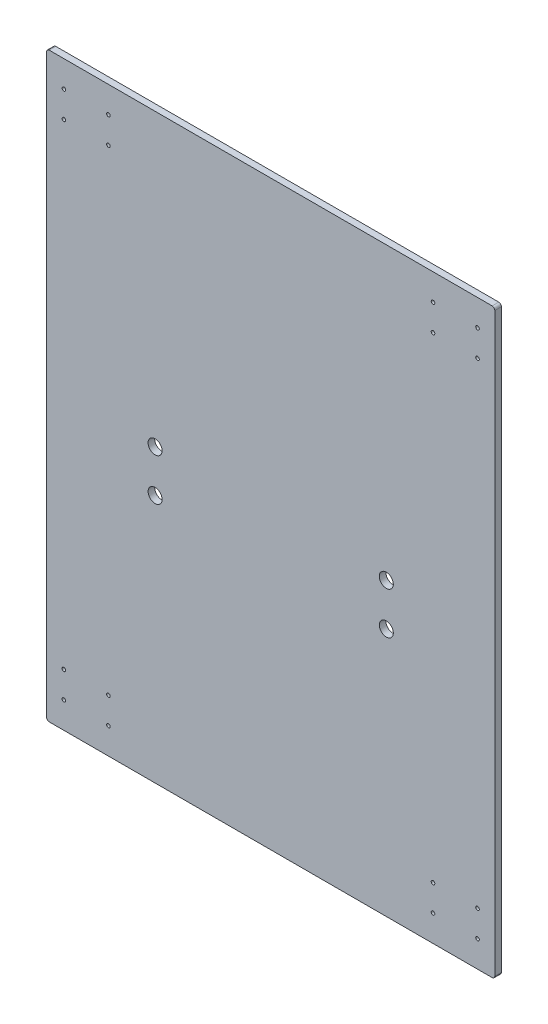
ISO-10303-21;
HEADER;
FILE_DESCRIPTION(('STEP AP214'),'2;1');
FILE_NAME('part.step','',(''),(''),'','','');
FILE_SCHEMA(('AUTOMOTIVE_DESIGN { 1 0 10303 214 1 1 1 1 }'));
ENDSEC;
DATA;
#1=APPLICATION_CONTEXT('core data for automotive mechanical design processes');
#2=APPLICATION_PROTOCOL_DEFINITION('international standard','automotive_design',2000,#1);
#3=PRODUCT_CONTEXT('',#1,'mechanical');
#4=PRODUCT('Part','Part','',(#3));
#5=PRODUCT_RELATED_PRODUCT_CATEGORY('part','',(#4));
#6=PRODUCT_DEFINITION_FORMATION('','',#4);
#7=PRODUCT_DEFINITION_CONTEXT('part definition',#1,'design');
#8=PRODUCT_DEFINITION('design','',#6,#7);
#9=PRODUCT_DEFINITION_SHAPE('','',#8);
#10=(LENGTH_UNIT() NAMED_UNIT(*) SI_UNIT(.MILLI.,.METRE.));
#11=(NAMED_UNIT(*) PLANE_ANGLE_UNIT() SI_UNIT($,.RADIAN.));
#12=(NAMED_UNIT(*) SI_UNIT($,.STERADIAN.) SOLID_ANGLE_UNIT());
#13=UNCERTAINTY_MEASURE_WITH_UNIT(LENGTH_MEASURE(1.E-05),#10,'distance_accuracy_value','');
#14=(GEOMETRIC_REPRESENTATION_CONTEXT(3) GLOBAL_UNCERTAINTY_ASSIGNED_CONTEXT((#13)) GLOBAL_UNIT_ASSIGNED_CONTEXT((#10,
#11,#12)) REPRESENTATION_CONTEXT('',''));
#15=CARTESIAN_POINT('',(0.,0.,0.));
#16=DIRECTION('',(0.,0.,1.));
#17=DIRECTION('',(1.,0.,0.));
#18=AXIS2_PLACEMENT_3D('',#15,#16,#17);
#19=CARTESIAN_POINT('',(0.,0.,0.));
#20=DIRECTION('',(0.,0.,1.));
#21=DIRECTION('',(1.,0.,0.));
#22=AXIS2_PLACEMENT_3D('',#19,#20,#21);
#23=PLANE('',#22);
#24=CARTESIAN_POINT('',(-21.4375999999999,-496.966887406221,0.));
#25=DIRECTION('',(0.,0.,-1.));
#26=DIRECTION('',(-1.,0.,0.));
#27=AXIS2_PLACEMENT_3D('',#24,#25,#26);
#28=CIRCLE('',#27,1.7272);
#29=CARTESIAN_POINT('',(-23.1647999999999,-496.966887406221,0.));
#30=VERTEX_POINT('',#29);
#31=EDGE_CURVE('E241',#30,#30,#28,.T.);
#32=ORIENTED_EDGE('',*,*,#31,.F.);
#33=EDGE_LOOP('',(#32));
#34=FACE_BOUND('',#33,.T.);
#35=CARTESIAN_POINT('',(377.0376,-471.566887406221,0.));
#36=DIRECTION('',(0.,0.,-1.));
#37=DIRECTION('',(-1.,0.,0.));
#38=AXIS2_PLACEMENT_3D('',#35,#36,#37);
#39=CIRCLE('',#38,1.72719999999998);
#40=CARTESIAN_POINT('',(375.3104,-471.566887406221,0.));
#41=VERTEX_POINT('',#40);
#42=EDGE_CURVE('E211',#41,#41,#39,.T.);
#43=ORIENTED_EDGE('',*,*,#42,.F.);
#44=EDGE_LOOP('',(#43));
#45=FACE_BOUND('',#44,.T.);
#46=CARTESIAN_POINT('',(377.0376,-496.966887406221,0.));
#47=DIRECTION('',(0.,0.,-1.));
#48=DIRECTION('',(-1.,0.,0.));
#49=AXIS2_PLACEMENT_3D('',#46,#47,#48);
#50=CIRCLE('',#49,1.72719999999998);
#51=CARTESIAN_POINT('',(375.3104,-496.966887406221,0.));
#52=VERTEX_POINT('',#51);
#53=EDGE_CURVE('E205',#52,#52,#50,.T.);
#54=ORIENTED_EDGE('',*,*,#53,.F.);
#55=EDGE_LOOP('',(#54));
#56=FACE_BOUND('',#55,.T.);
#57=CARTESIAN_POINT('',(289.17138,-241.82,0.));
#58=DIRECTION('',(0.,0.,-1.));
#59=DIRECTION('',(-1.,0.,0.));
#60=AXIS2_PLACEMENT_3D('',#57,#58,#59);
#61=CIRCLE('',#60,6.74624000000001);
#62=CARTESIAN_POINT('',(282.42514,-241.82,0.));
#63=VERTEX_POINT('',#62);
#64=EDGE_CURVE('E199',#63,#63,#61,.T.);
#65=ORIENTED_EDGE('',*,*,#64,.F.);
#66=EDGE_LOOP('',(#65));
#67=FACE_BOUND('',#66,.T.);
#68=CARTESIAN_POINT('',(66.4286200000001,-282.46,0.));
#69=DIRECTION('',(0.,0.,-1.));
#70=DIRECTION('',(-1.,0.,0.));
#71=AXIS2_PLACEMENT_3D('',#68,#69,#70);
#72=CIRCLE('',#71,6.74624);
#73=CARTESIAN_POINT('',(59.6823800000001,-282.46,0.));
#74=VERTEX_POINT('',#73);
#75=EDGE_CURVE('E187',#74,#74,#72,.T.);
#76=ORIENTED_EDGE('',*,*,#75,.F.);
#77=EDGE_LOOP('',(#76));
#78=FACE_BOUND('',#77,.T.);
#79=CARTESIAN_POINT('',(66.4286200000001,-241.82,0.));
#80=DIRECTION('',(0.,0.,-1.));
#81=DIRECTION('',(-1.,0.,0.));
#82=AXIS2_PLACEMENT_3D('',#79,#80,#81);
#83=CIRCLE('',#82,6.74624);
#84=CARTESIAN_POINT('',(59.6823800000001,-241.82,0.));
#85=VERTEX_POINT('',#84);
#86=EDGE_CURVE('E174',#85,#85,#83,.T.);
#87=ORIENTED_EDGE('',*,*,#86,.F.);
#88=EDGE_LOOP('',(#87));
#89=FACE_BOUND('',#88,.T.);
#90=DIRECTION('',(-1.,0.,0.));
#91=VECTOR('',#90,1.);
#92=CARTESIAN_POINT('',(393.7,38.1,0.));
#93=LINE('',#92,#91);
#94=CARTESIAN_POINT('',(391.16,38.1,0.));
#95=VERTEX_POINT('',#94);
#96=CARTESIAN_POINT('',(-35.5599999999999,38.1,0.));
#97=VERTEX_POINT('',#96);
#98=EDGE_CURVE('E124',#95,#97,#93,.T.);
#99=ORIENTED_EDGE('',*,*,#98,.F.);
#100=CARTESIAN_POINT('',(391.16,35.56,0.));
#101=DIRECTION('',(0.,0.,1.));
#102=DIRECTION('',(1.,0.,0.));
#103=AXIS2_PLACEMENT_3D('',#100,#101,#102);
#104=CIRCLE('',#103,2.54);
#105=CARTESIAN_POINT('',(393.7,35.56,0.));
#106=VERTEX_POINT('',#105);
#107=EDGE_CURVE('E107',#95,#106,#104,.F.);
#108=ORIENTED_EDGE('',*,*,#107,.T.);
#109=DIRECTION('',(0.,1.,0.));
#110=VECTOR('',#109,1.);
#111=CARTESIAN_POINT('',(393.7,-522.366887406221,0.));
#112=LINE('',#111,#110);
#113=CARTESIAN_POINT('',(393.7,-519.826887406221,0.));
#114=VERTEX_POINT('',#113);
#115=EDGE_CURVE('E134',#114,#106,#112,.T.);
#116=ORIENTED_EDGE('',*,*,#115,.F.);
#117=CARTESIAN_POINT('',(391.16,-519.826887406221,0.));
#118=DIRECTION('',(0.,0.,1.));
#119=DIRECTION('',(1.,0.,0.));
#120=AXIS2_PLACEMENT_3D('',#117,#118,#119);
#121=CIRCLE('',#120,2.54);
#122=CARTESIAN_POINT('',(391.16,-522.366887406221,0.));
#123=VERTEX_POINT('',#122);
#124=EDGE_CURVE('E118',#114,#123,#121,.F.);
#125=ORIENTED_EDGE('',*,*,#124,.T.);
#126=DIRECTION('',(1.,0.,0.));
#127=VECTOR('',#126,1.);
#128=CARTESIAN_POINT('',(393.7,-522.366887406221,0.));
#129=LINE('',#128,#127);
#130=CARTESIAN_POINT('',(-35.5599999999999,-522.366887406221,0.));
#131=VERTEX_POINT('',#130);
#132=EDGE_CURVE('E138',#131,#123,#129,.T.);
#133=ORIENTED_EDGE('',*,*,#132,.F.);
#134=CARTESIAN_POINT('',(-35.56,-519.826887406221,0.));
#135=DIRECTION('',(0.,0.,1.));
#136=DIRECTION('',(1.,0.,0.));
#137=AXIS2_PLACEMENT_3D('',#134,#135,#136);
#138=CIRCLE('',#137,2.54);
#139=CARTESIAN_POINT('',(-38.1,-519.826887406221,0.));
#140=VERTEX_POINT('',#139);
#141=EDGE_CURVE('E144',#131,#140,#138,.F.);
#142=ORIENTED_EDGE('',*,*,#141,.T.);
#143=DIRECTION('',(0.,-1.,0.));
#144=VECTOR('',#143,1.);
#145=CARTESIAN_POINT('',(-38.1,-522.366887406221,0.));
#146=LINE('',#145,#144);
#147=CARTESIAN_POINT('',(-38.1,35.56,0.));
#148=VERTEX_POINT('',#147);
#149=EDGE_CURVE('E166',#148,#140,#146,.T.);
#150=ORIENTED_EDGE('',*,*,#149,.F.);
#151=CARTESIAN_POINT('',(-35.56,35.56,0.));
#152=DIRECTION('',(0.,0.,1.));
#153=DIRECTION('',(1.,0.,0.));
#154=AXIS2_PLACEMENT_3D('',#151,#152,#153);
#155=CIRCLE('',#154,2.54);
#156=EDGE_CURVE('E128',#148,#97,#155,.F.);
#157=ORIENTED_EDGE('',*,*,#156,.T.);
#158=EDGE_LOOP('',(#99,#108,#116,#125,#133,#142,#150,#157));
#159=FACE_BOUND('',#158,.T.);
#160=CARTESIAN_POINT('',(289.17138,-282.46,0.));
#161=DIRECTION('',(0.,0.,-1.));
#162=DIRECTION('',(-1.,0.,0.));
#163=AXIS2_PLACEMENT_3D('',#160,#161,#162);
#164=CIRCLE('',#163,6.74624000000001);
#165=CARTESIAN_POINT('',(282.42514,-282.46,0.));
#166=VERTEX_POINT('',#165);
#167=EDGE_CURVE('E193',#166,#166,#164,.T.);
#168=ORIENTED_EDGE('',*,*,#167,.F.);
#169=EDGE_LOOP('',(#168));
#170=FACE_BOUND('',#169,.T.);
#171=CARTESIAN_POINT('',(334.1624,-496.966887406221,0.));
#172=DIRECTION('',(0.,0.,-1.));
#173=DIRECTION('',(-1.,0.,0.));
#174=AXIS2_PLACEMENT_3D('',#171,#172,#173);
#175=CIRCLE('',#174,1.72719999999998);
#176=CARTESIAN_POINT('',(332.4352,-496.966887406221,0.));
#177=VERTEX_POINT('',#176);
#178=EDGE_CURVE('E217',#177,#177,#175,.T.);
#179=ORIENTED_EDGE('',*,*,#178,.F.);
#180=EDGE_LOOP('',(#179));
#181=FACE_BOUND('',#180,.T.);
#182=CARTESIAN_POINT('',(334.1624,-471.566887406221,0.));
#183=DIRECTION('',(0.,0.,-1.));
#184=DIRECTION('',(-1.,0.,0.));
#185=AXIS2_PLACEMENT_3D('',#182,#183,#184);
#186=CIRCLE('',#185,1.72719999999998);
#187=CARTESIAN_POINT('',(332.4352,-471.566887406221,0.));
#188=VERTEX_POINT('',#187);
#189=EDGE_CURVE('E223',#188,#188,#186,.T.);
#190=ORIENTED_EDGE('',*,*,#189,.F.);
#191=EDGE_LOOP('',(#190));
#192=FACE_BOUND('',#191,.T.);
#193=CARTESIAN_POINT('',(21.4376000000001,-471.566887406221,0.));
#194=DIRECTION('',(0.,0.,-1.));
#195=DIRECTION('',(-1.,0.,0.));
#196=AXIS2_PLACEMENT_3D('',#193,#194,#195);
#197=CIRCLE('',#196,1.7272);
#198=CARTESIAN_POINT('',(19.7104000000001,-471.566887406221,0.));
#199=VERTEX_POINT('',#198);
#200=EDGE_CURVE('E229',#199,#199,#197,.T.);
#201=ORIENTED_EDGE('',*,*,#200,.F.);
#202=EDGE_LOOP('',(#201));
#203=FACE_BOUND('',#202,.T.);
#204=CARTESIAN_POINT('',(-21.4375999999999,-471.566887406221,0.));
#205=DIRECTION('',(0.,0.,-1.));
#206=DIRECTION('',(-1.,0.,0.));
#207=AXIS2_PLACEMENT_3D('',#204,#205,#206);
#208=CIRCLE('',#207,1.7272);
#209=CARTESIAN_POINT('',(-23.1647999999999,-471.566887406221,0.));
#210=VERTEX_POINT('',#209);
#211=EDGE_CURVE('E235',#210,#210,#208,.T.);
#212=ORIENTED_EDGE('',*,*,#211,.F.);
#213=EDGE_LOOP('',(#212));
#214=FACE_BOUND('',#213,.T.);
#215=CARTESIAN_POINT('',(21.4376000000001,-496.966887406221,0.));
#216=DIRECTION('',(0.,0.,-1.));
#217=DIRECTION('',(-1.,0.,0.));
#218=AXIS2_PLACEMENT_3D('',#215,#216,#217);
#219=CIRCLE('',#218,1.7272);
#220=CARTESIAN_POINT('',(19.7104000000001,-496.966887406221,0.));
#221=VERTEX_POINT('',#220);
#222=EDGE_CURVE('E247',#221,#221,#219,.T.);
#223=ORIENTED_EDGE('',*,*,#222,.F.);
#224=EDGE_LOOP('',(#223));
#225=FACE_BOUND('',#224,.T.);
#226=CARTESIAN_POINT('',(21.4376000000001,12.7,0.));
#227=DIRECTION('',(0.,0.,-1.));
#228=DIRECTION('',(-1.,0.,0.));
#229=AXIS2_PLACEMENT_3D('',#226,#227,#228);
#230=CIRCLE('',#229,1.7272);
#231=CARTESIAN_POINT('',(19.7104000000001,12.7,0.));
#232=VERTEX_POINT('',#231);
#233=EDGE_CURVE('E253',#232,#232,#230,.T.);
#234=ORIENTED_EDGE('',*,*,#233,.F.);
#235=EDGE_LOOP('',(#234));
#236=FACE_BOUND('',#235,.T.);
#237=CARTESIAN_POINT('',(-21.4375999999999,12.7,0.));
#238=DIRECTION('',(0.,0.,-1.));
#239=DIRECTION('',(-1.,0.,0.));
#240=AXIS2_PLACEMENT_3D('',#237,#238,#239);
#241=CIRCLE('',#240,1.7272);
#242=CARTESIAN_POINT('',(-23.1647999999999,12.7,0.));
#243=VERTEX_POINT('',#242);
#244=EDGE_CURVE('E259',#243,#243,#241,.T.);
#245=ORIENTED_EDGE('',*,*,#244,.F.);
#246=EDGE_LOOP('',(#245));
#247=FACE_BOUND('',#246,.T.);
#248=CARTESIAN_POINT('',(-21.4375999999999,-12.7,0.));
#249=DIRECTION('',(0.,0.,-1.));
#250=DIRECTION('',(-1.,0.,0.));
#251=AXIS2_PLACEMENT_3D('',#248,#249,#250);
#252=CIRCLE('',#251,1.7272);
#253=CARTESIAN_POINT('',(-23.1647999999999,-12.7,0.));
#254=VERTEX_POINT('',#253);
#255=EDGE_CURVE('E265',#254,#254,#252,.T.);
#256=ORIENTED_EDGE('',*,*,#255,.F.);
#257=EDGE_LOOP('',(#256));
#258=FACE_BOUND('',#257,.T.);
#259=CARTESIAN_POINT('',(21.4376000000001,-12.7,0.));
#260=DIRECTION('',(0.,0.,-1.));
#261=DIRECTION('',(-1.,0.,0.));
#262=AXIS2_PLACEMENT_3D('',#259,#260,#261);
#263=CIRCLE('',#262,1.7272);
#264=CARTESIAN_POINT('',(19.7104000000001,-12.7,0.));
#265=VERTEX_POINT('',#264);
#266=EDGE_CURVE('E271',#265,#265,#263,.T.);
#267=ORIENTED_EDGE('',*,*,#266,.F.);
#268=EDGE_LOOP('',(#267));
#269=FACE_BOUND('',#268,.T.);
#270=CARTESIAN_POINT('',(334.1624,-12.7,0.));
#271=DIRECTION('',(0.,0.,-1.));
#272=DIRECTION('',(-1.,0.,0.));
#273=AXIS2_PLACEMENT_3D('',#270,#271,#272);
#274=CIRCLE('',#273,1.72719999999998);
#275=CARTESIAN_POINT('',(332.4352,-12.7,0.));
#276=VERTEX_POINT('',#275);
#277=EDGE_CURVE('E277',#276,#276,#274,.T.);
#278=ORIENTED_EDGE('',*,*,#277,.F.);
#279=EDGE_LOOP('',(#278));
#280=FACE_BOUND('',#279,.T.);
#281=CARTESIAN_POINT('',(334.1624,12.7,0.));
#282=DIRECTION('',(0.,0.,-1.));
#283=DIRECTION('',(-1.,0.,0.));
#284=AXIS2_PLACEMENT_3D('',#281,#282,#283);
#285=CIRCLE('',#284,1.72719999999998);
#286=CARTESIAN_POINT('',(332.4352,12.7,0.));
#287=VERTEX_POINT('',#286);
#288=EDGE_CURVE('E283',#287,#287,#285,.T.);
#289=ORIENTED_EDGE('',*,*,#288,.F.);
#290=EDGE_LOOP('',(#289));
#291=FACE_BOUND('',#290,.T.);
#292=CARTESIAN_POINT('',(377.0376,-12.7,0.));
#293=DIRECTION('',(0.,0.,-1.));
#294=DIRECTION('',(-1.,0.,0.));
#295=AXIS2_PLACEMENT_3D('',#292,#293,#294);
#296=CIRCLE('',#295,1.72719999999998);
#297=CARTESIAN_POINT('',(375.3104,-12.7,0.));
#298=VERTEX_POINT('',#297);
#299=EDGE_CURVE('E289',#298,#298,#296,.T.);
#300=ORIENTED_EDGE('',*,*,#299,.F.);
#301=EDGE_LOOP('',(#300));
#302=FACE_BOUND('',#301,.T.);
#303=CARTESIAN_POINT('',(377.0376,12.7,0.));
#304=DIRECTION('',(0.,0.,-1.));
#305=DIRECTION('',(-1.,0.,0.));
#306=AXIS2_PLACEMENT_3D('',#303,#304,#305);
#307=CIRCLE('',#306,1.72719999999998);
#308=CARTESIAN_POINT('',(375.3104,12.7,0.));
#309=VERTEX_POINT('',#308);
#310=EDGE_CURVE('E295',#309,#309,#307,.T.);
#311=ORIENTED_EDGE('',*,*,#310,.F.);
#312=EDGE_LOOP('',(#311));
#313=FACE_BOUND('',#312,.T.);
#314=ADVANCED_FACE('F41',(#34,#45,#56,#67,#78,#89,#159,#170,#181,#192,#203,#214,#225,#236,#247,
#258,#269,#280,#291,#302,#313),#23,.F.);
#315=CARTESIAN_POINT('',(-38.1,-522.366887406221,6.35));
#316=DIRECTION('',(1.,0.,0.));
#317=DIRECTION('',(0.,0.,-1.));
#318=AXIS2_PLACEMENT_3D('',#315,#316,#317);
#319=PLANE('',#318);
#320=ORIENTED_EDGE('',*,*,#149,.T.);
#321=DIRECTION('',(0.,0.,-1.));
#322=VECTOR('',#321,1.);
#323=CARTESIAN_POINT('',(-38.1,-519.826887406221,6.35));
#324=LINE('',#323,#322);
#325=CARTESIAN_POINT('',(-38.1,-519.826887406221,6.35));
#326=VERTEX_POINT('',#325);
#327=EDGE_CURVE('E11',#140,#326,#324,.F.);
#328=ORIENTED_EDGE('',*,*,#327,.T.);
#329=DIRECTION('',(0.,-1.,0.));
#330=VECTOR('',#329,1.);
#331=CARTESIAN_POINT('',(-38.1,-522.366887406221,6.35));
#332=LINE('',#331,#330);
#333=CARTESIAN_POINT('',(-38.1,35.56,6.35));
#334=VERTEX_POINT('',#333);
#335=EDGE_CURVE('E133',#334,#326,#332,.T.);
#336=ORIENTED_EDGE('',*,*,#335,.F.);
#337=DIRECTION('',(0.,0.,-1.));
#338=VECTOR('',#337,1.);
#339=CARTESIAN_POINT('',(-38.1,35.56,6.35));
#340=LINE('',#339,#338);
#341=EDGE_CURVE('E49',#334,#148,#340,.T.);
#342=ORIENTED_EDGE('',*,*,#341,.T.);
#343=EDGE_LOOP('',(#320,#328,#336,#342));
#344=FACE_BOUND('',#343,.T.);
#345=ADVANCED_FACE('F165',(#344),#319,.F.);
#346=CARTESIAN_POINT('',(393.7,-522.366887406221,6.35));
#347=DIRECTION('',(0.,1.,0.));
#348=DIRECTION('',(0.,0.,1.));
#349=AXIS2_PLACEMENT_3D('',#346,#347,#348);
#350=PLANE('',#349);
#351=ORIENTED_EDGE('',*,*,#132,.T.);
#352=DIRECTION('',(0.,0.,-1.));
#353=VECTOR('',#352,1.);
#354=CARTESIAN_POINT('',(391.16,-522.366887406221,6.35));
#355=LINE('',#354,#353);
#356=CARTESIAN_POINT('',(391.16,-522.366887406221,6.35));
#357=VERTEX_POINT('',#356);
#358=EDGE_CURVE('E56',#123,#357,#355,.F.);
#359=ORIENTED_EDGE('',*,*,#358,.T.);
#360=DIRECTION('',(1.,0.,0.));
#361=VECTOR('',#360,1.);
#362=CARTESIAN_POINT('',(393.7,-522.366887406221,6.35));
#363=LINE('',#362,#361);
#364=CARTESIAN_POINT('',(-35.5599999999999,-522.366887406221,6.35));
#365=VERTEX_POINT('',#364);
#366=EDGE_CURVE('E136',#365,#357,#363,.T.);
#367=ORIENTED_EDGE('',*,*,#366,.F.);
#368=DIRECTION('',(0.,0.,-1.));
#369=VECTOR('',#368,1.);
#370=CARTESIAN_POINT('',(-35.56,-522.366887406221,6.35));
#371=LINE('',#370,#369);
#372=EDGE_CURVE('E157',#365,#131,#371,.T.);
#373=ORIENTED_EDGE('',*,*,#372,.T.);
#374=EDGE_LOOP('',(#351,#359,#367,#373));
#375=FACE_BOUND('',#374,.T.);
#376=ADVANCED_FACE('F310',(#375),#350,.F.);
#377=CARTESIAN_POINT('',(393.7,-522.366887406221,6.35));
#378=DIRECTION('',(-1.,0.,0.));
#379=DIRECTION('',(0.,0.,1.));
#380=AXIS2_PLACEMENT_3D('',#377,#378,#379);
#381=PLANE('',#380);
#382=ORIENTED_EDGE('',*,*,#115,.T.);
#383=DIRECTION('',(0.,0.,-1.));
#384=VECTOR('',#383,1.);
#385=CARTESIAN_POINT('',(393.7,35.56,6.35));
#386=LINE('',#385,#384);
#387=CARTESIAN_POINT('',(393.7,35.56,6.35));
#388=VERTEX_POINT('',#387);
#389=EDGE_CURVE('E112',#106,#388,#386,.F.);
#390=ORIENTED_EDGE('',*,*,#389,.T.);
#391=DIRECTION('',(0.,1.,0.));
#392=VECTOR('',#391,1.);
#393=CARTESIAN_POINT('',(393.7,-522.366887406221,6.35));
#394=LINE('',#393,#392);
#395=CARTESIAN_POINT('',(393.7,-519.826887406221,6.35));
#396=VERTEX_POINT('',#395);
#397=EDGE_CURVE('E178',#396,#388,#394,.T.);
#398=ORIENTED_EDGE('',*,*,#397,.F.);
#399=DIRECTION('',(0.,0.,-1.));
#400=VECTOR('',#399,1.);
#401=CARTESIAN_POINT('',(393.7,-519.826887406221,6.35));
#402=LINE('',#401,#400);
#403=EDGE_CURVE('E117',#396,#114,#402,.T.);
#404=ORIENTED_EDGE('',*,*,#403,.T.);
#405=EDGE_LOOP('',(#382,#390,#398,#404));
#406=FACE_BOUND('',#405,.T.);
#407=ADVANCED_FACE('F320',(#406),#381,.F.);
#408=CARTESIAN_POINT('',(393.7,38.1,6.35));
#409=DIRECTION('',(0.,-1.,0.));
#410=DIRECTION('',(0.,0.,-1.));
#411=AXIS2_PLACEMENT_3D('',#408,#409,#410);
#412=PLANE('',#411);
#413=DIRECTION('',(-1.,0.,0.));
#414=VECTOR('',#413,1.);
#415=CARTESIAN_POINT('',(393.7,38.1,6.35));
#416=LINE('',#415,#414);
#417=CARTESIAN_POINT('',(391.16,38.1,6.35));
#418=VERTEX_POINT('',#417);
#419=CARTESIAN_POINT('',(-35.5599999999999,38.1,6.35));
#420=VERTEX_POINT('',#419);
#421=EDGE_CURVE('E127',#418,#420,#416,.T.);
#422=ORIENTED_EDGE('',*,*,#421,.F.);
#423=DIRECTION('',(0.,0.,-1.));
#424=VECTOR('',#423,1.);
#425=CARTESIAN_POINT('',(391.16,38.1,6.35));
#426=LINE('',#425,#424);
#427=EDGE_CURVE('E111',#418,#95,#426,.T.);
#428=ORIENTED_EDGE('',*,*,#427,.T.);
#429=ORIENTED_EDGE('',*,*,#98,.T.);
#430=DIRECTION('',(0.,0.,-1.));
#431=VECTOR('',#430,1.);
#432=CARTESIAN_POINT('',(-35.56,38.1,6.35));
#433=LINE('',#432,#431);
#434=EDGE_CURVE('E129',#97,#420,#433,.F.);
#435=ORIENTED_EDGE('',*,*,#434,.T.);
#436=EDGE_LOOP('',(#422,#428,#429,#435));
#437=FACE_BOUND('',#436,.T.);
#438=ADVANCED_FACE('F123',(#437),#412,.F.);
#439=CARTESIAN_POINT('',(0.,0.,6.35));
#440=DIRECTION('',(0.,0.,1.));
#441=DIRECTION('',(1.,0.,0.));
#442=AXIS2_PLACEMENT_3D('',#439,#440,#441);
#443=PLANE('',#442);
#444=CARTESIAN_POINT('',(377.0376,12.7,6.35));
#445=DIRECTION('',(0.,0.,1.));
#446=DIRECTION('',(1.,0.,0.));
#447=AXIS2_PLACEMENT_3D('',#444,#445,#446);
#448=CIRCLE('',#447,1.72719999999998);
#449=CARTESIAN_POINT('',(378.7648,12.7,6.35));
#450=VERTEX_POINT('',#449);
#451=EDGE_CURVE('E292',#450,#450,#448,.T.);
#452=ORIENTED_EDGE('',*,*,#451,.F.);
#453=EDGE_LOOP('',(#452));
#454=FACE_BOUND('',#453,.T.);
#455=CARTESIAN_POINT('',(377.0376,-12.7,6.35));
#456=DIRECTION('',(0.,0.,1.));
#457=DIRECTION('',(1.,0.,0.));
#458=AXIS2_PLACEMENT_3D('',#455,#456,#457);
#459=CIRCLE('',#458,1.72719999999998);
#460=CARTESIAN_POINT('',(378.7648,-12.7,6.35));
#461=VERTEX_POINT('',#460);
#462=EDGE_CURVE('E286',#461,#461,#459,.T.);
#463=ORIENTED_EDGE('',*,*,#462,.F.);
#464=EDGE_LOOP('',(#463));
#465=FACE_BOUND('',#464,.T.);
#466=CARTESIAN_POINT('',(334.1624,12.7,6.35));
#467=DIRECTION('',(0.,0.,1.));
#468=DIRECTION('',(1.,0.,0.));
#469=AXIS2_PLACEMENT_3D('',#466,#467,#468);
#470=CIRCLE('',#469,1.72719999999998);
#471=CARTESIAN_POINT('',(335.8896,12.7,6.35));
#472=VERTEX_POINT('',#471);
#473=EDGE_CURVE('E280',#472,#472,#470,.T.);
#474=ORIENTED_EDGE('',*,*,#473,.F.);
#475=EDGE_LOOP('',(#474));
#476=FACE_BOUND('',#475,.T.);
#477=CARTESIAN_POINT('',(334.1624,-12.7,6.35));
#478=DIRECTION('',(0.,0.,1.));
#479=DIRECTION('',(1.,0.,0.));
#480=AXIS2_PLACEMENT_3D('',#477,#478,#479);
#481=CIRCLE('',#480,1.72719999999998);
#482=CARTESIAN_POINT('',(335.8896,-12.7,6.35));
#483=VERTEX_POINT('',#482);
#484=EDGE_CURVE('E274',#483,#483,#481,.T.);
#485=ORIENTED_EDGE('',*,*,#484,.F.);
#486=EDGE_LOOP('',(#485));
#487=FACE_BOUND('',#486,.T.);
#488=CARTESIAN_POINT('',(21.4376000000001,-12.7,6.35));
#489=DIRECTION('',(0.,0.,1.));
#490=DIRECTION('',(1.,0.,0.));
#491=AXIS2_PLACEMENT_3D('',#488,#489,#490);
#492=CIRCLE('',#491,1.7272);
#493=CARTESIAN_POINT('',(23.1648000000001,-12.7,6.35));
#494=VERTEX_POINT('',#493);
#495=EDGE_CURVE('E268',#494,#494,#492,.T.);
#496=ORIENTED_EDGE('',*,*,#495,.F.);
#497=EDGE_LOOP('',(#496));
#498=FACE_BOUND('',#497,.T.);
#499=CARTESIAN_POINT('',(-21.4375999999999,-12.7,6.35));
#500=DIRECTION('',(0.,0.,1.));
#501=DIRECTION('',(1.,0.,0.));
#502=AXIS2_PLACEMENT_3D('',#499,#500,#501);
#503=CIRCLE('',#502,1.7272);
#504=CARTESIAN_POINT('',(-19.7103999999999,-12.7,6.35));
#505=VERTEX_POINT('',#504);
#506=EDGE_CURVE('E262',#505,#505,#503,.T.);
#507=ORIENTED_EDGE('',*,*,#506,.F.);
#508=EDGE_LOOP('',(#507));
#509=FACE_BOUND('',#508,.T.);
#510=CARTESIAN_POINT('',(-21.4375999999999,12.7,6.35));
#511=DIRECTION('',(0.,0.,1.));
#512=DIRECTION('',(1.,0.,0.));
#513=AXIS2_PLACEMENT_3D('',#510,#511,#512);
#514=CIRCLE('',#513,1.7272);
#515=CARTESIAN_POINT('',(-19.7103999999999,12.7,6.35));
#516=VERTEX_POINT('',#515);
#517=EDGE_CURVE('E256',#516,#516,#514,.T.);
#518=ORIENTED_EDGE('',*,*,#517,.F.);
#519=EDGE_LOOP('',(#518));
#520=FACE_BOUND('',#519,.T.);
#521=CARTESIAN_POINT('',(21.4376000000001,12.7,6.35));
#522=DIRECTION('',(0.,0.,1.));
#523=DIRECTION('',(1.,0.,0.));
#524=AXIS2_PLACEMENT_3D('',#521,#522,#523);
#525=CIRCLE('',#524,1.7272);
#526=CARTESIAN_POINT('',(23.1648000000001,12.7,6.35));
#527=VERTEX_POINT('',#526);
#528=EDGE_CURVE('E250',#527,#527,#525,.T.);
#529=ORIENTED_EDGE('',*,*,#528,.F.);
#530=EDGE_LOOP('',(#529));
#531=FACE_BOUND('',#530,.T.);
#532=CARTESIAN_POINT('',(21.4376000000001,-496.966887406221,6.35));
#533=DIRECTION('',(0.,0.,1.));
#534=DIRECTION('',(1.,0.,0.));
#535=AXIS2_PLACEMENT_3D('',#532,#533,#534);
#536=CIRCLE('',#535,1.7272);
#537=CARTESIAN_POINT('',(23.1648000000001,-496.966887406221,6.35));
#538=VERTEX_POINT('',#537);
#539=EDGE_CURVE('E244',#538,#538,#536,.T.);
#540=ORIENTED_EDGE('',*,*,#539,.F.);
#541=EDGE_LOOP('',(#540));
#542=FACE_BOUND('',#541,.T.);
#543=CARTESIAN_POINT('',(-21.4375999999999,-496.966887406221,6.35));
#544=DIRECTION('',(0.,0.,1.));
#545=DIRECTION('',(1.,0.,0.));
#546=AXIS2_PLACEMENT_3D('',#543,#544,#545);
#547=CIRCLE('',#546,1.7272);
#548=CARTESIAN_POINT('',(-19.7103999999999,-496.966887406221,6.35));
#549=VERTEX_POINT('',#548);
#550=EDGE_CURVE('E238',#549,#549,#547,.T.);
#551=ORIENTED_EDGE('',*,*,#550,.F.);
#552=EDGE_LOOP('',(#551));
#553=FACE_BOUND('',#552,.T.);
#554=CARTESIAN_POINT('',(-21.4375999999999,-471.566887406221,6.35));
#555=DIRECTION('',(0.,0.,1.));
#556=DIRECTION('',(1.,0.,0.));
#557=AXIS2_PLACEMENT_3D('',#554,#555,#556);
#558=CIRCLE('',#557,1.7272);
#559=CARTESIAN_POINT('',(-19.7103999999999,-471.566887406221,6.35));
#560=VERTEX_POINT('',#559);
#561=EDGE_CURVE('E232',#560,#560,#558,.T.);
#562=ORIENTED_EDGE('',*,*,#561,.F.);
#563=EDGE_LOOP('',(#562));
#564=FACE_BOUND('',#563,.T.);
#565=CARTESIAN_POINT('',(21.4376000000001,-471.566887406221,6.35));
#566=DIRECTION('',(0.,0.,1.));
#567=DIRECTION('',(1.,0.,0.));
#568=AXIS2_PLACEMENT_3D('',#565,#566,#567);
#569=CIRCLE('',#568,1.7272);
#570=CARTESIAN_POINT('',(23.1648000000001,-471.566887406221,6.35));
#571=VERTEX_POINT('',#570);
#572=EDGE_CURVE('E226',#571,#571,#569,.T.);
#573=ORIENTED_EDGE('',*,*,#572,.F.);
#574=EDGE_LOOP('',(#573));
#575=FACE_BOUND('',#574,.T.);
#576=CARTESIAN_POINT('',(334.1624,-471.566887406221,6.35));
#577=DIRECTION('',(0.,0.,1.));
#578=DIRECTION('',(1.,0.,0.));
#579=AXIS2_PLACEMENT_3D('',#576,#577,#578);
#580=CIRCLE('',#579,1.72719999999998);
#581=CARTESIAN_POINT('',(335.8896,-471.566887406221,6.35));
#582=VERTEX_POINT('',#581);
#583=EDGE_CURVE('E220',#582,#582,#580,.T.);
#584=ORIENTED_EDGE('',*,*,#583,.F.);
#585=EDGE_LOOP('',(#584));
#586=FACE_BOUND('',#585,.T.);
#587=CARTESIAN_POINT('',(334.1624,-496.966887406221,6.35));
#588=DIRECTION('',(0.,0.,1.));
#589=DIRECTION('',(1.,0.,0.));
#590=AXIS2_PLACEMENT_3D('',#587,#588,#589);
#591=CIRCLE('',#590,1.72719999999998);
#592=CARTESIAN_POINT('',(335.8896,-496.966887406221,6.35));
#593=VERTEX_POINT('',#592);
#594=EDGE_CURVE('E214',#593,#593,#591,.T.);
#595=ORIENTED_EDGE('',*,*,#594,.F.);
#596=EDGE_LOOP('',(#595));
#597=FACE_BOUND('',#596,.T.);
#598=CARTESIAN_POINT('',(377.0376,-471.566887406221,6.35));
#599=DIRECTION('',(0.,0.,1.));
#600=DIRECTION('',(1.,0.,0.));
#601=AXIS2_PLACEMENT_3D('',#598,#599,#600);
#602=CIRCLE('',#601,1.72719999999998);
#603=CARTESIAN_POINT('',(378.7648,-471.566887406221,6.35));
#604=VERTEX_POINT('',#603);
#605=EDGE_CURVE('E208',#604,#604,#602,.T.);
#606=ORIENTED_EDGE('',*,*,#605,.F.);
#607=EDGE_LOOP('',(#606));
#608=FACE_BOUND('',#607,.T.);
#609=CARTESIAN_POINT('',(377.0376,-496.966887406221,6.35));
#610=DIRECTION('',(0.,0.,1.));
#611=DIRECTION('',(1.,0.,0.));
#612=AXIS2_PLACEMENT_3D('',#609,#610,#611);
#613=CIRCLE('',#612,1.72719999999998);
#614=CARTESIAN_POINT('',(378.7648,-496.966887406221,6.35));
#615=VERTEX_POINT('',#614);
#616=EDGE_CURVE('E202',#615,#615,#613,.T.);
#617=ORIENTED_EDGE('',*,*,#616,.F.);
#618=EDGE_LOOP('',(#617));
#619=FACE_BOUND('',#618,.T.);
#620=CARTESIAN_POINT('',(289.17138,-241.82,6.35));
#621=DIRECTION('',(0.,0.,1.));
#622=DIRECTION('',(1.,0.,0.));
#623=AXIS2_PLACEMENT_3D('',#620,#621,#622);
#624=CIRCLE('',#623,6.74624000000001);
#625=CARTESIAN_POINT('',(295.91762,-241.82,6.35));
#626=VERTEX_POINT('',#625);
#627=EDGE_CURVE('E196',#626,#626,#624,.T.);
#628=ORIENTED_EDGE('',*,*,#627,.F.);
#629=EDGE_LOOP('',(#628));
#630=FACE_BOUND('',#629,.T.);
#631=CARTESIAN_POINT('',(289.17138,-282.46,6.35));
#632=DIRECTION('',(0.,0.,1.));
#633=DIRECTION('',(1.,0.,0.));
#634=AXIS2_PLACEMENT_3D('',#631,#632,#633);
#635=CIRCLE('',#634,6.74624000000001);
#636=CARTESIAN_POINT('',(295.91762,-282.46,6.35));
#637=VERTEX_POINT('',#636);
#638=EDGE_CURVE('E190',#637,#637,#635,.T.);
#639=ORIENTED_EDGE('',*,*,#638,.F.);
#640=EDGE_LOOP('',(#639));
#641=FACE_BOUND('',#640,.T.);
#642=CARTESIAN_POINT('',(66.4286200000001,-282.46,6.35));
#643=DIRECTION('',(0.,0.,1.));
#644=DIRECTION('',(1.,0.,0.));
#645=AXIS2_PLACEMENT_3D('',#642,#643,#644);
#646=CIRCLE('',#645,6.74624);
#647=CARTESIAN_POINT('',(73.1748600000001,-282.46,6.35));
#648=VERTEX_POINT('',#647);
#649=EDGE_CURVE('E184',#648,#648,#646,.T.);
#650=ORIENTED_EDGE('',*,*,#649,.F.);
#651=EDGE_LOOP('',(#650));
#652=FACE_BOUND('',#651,.T.);
#653=CARTESIAN_POINT('',(66.4286200000001,-241.82,6.35));
#654=DIRECTION('',(0.,0.,1.));
#655=DIRECTION('',(1.,0.,0.));
#656=AXIS2_PLACEMENT_3D('',#653,#654,#655);
#657=CIRCLE('',#656,6.74624);
#658=CARTESIAN_POINT('',(73.1748600000001,-241.82,6.35));
#659=VERTEX_POINT('',#658);
#660=EDGE_CURVE('E171',#659,#659,#657,.T.);
#661=ORIENTED_EDGE('',*,*,#660,.F.);
#662=EDGE_LOOP('',(#661));
#663=FACE_BOUND('',#662,.T.);
#664=ORIENTED_EDGE('',*,*,#397,.T.);
#665=CARTESIAN_POINT('',(391.16,35.56,6.35));
#666=DIRECTION('',(0.,0.,1.));
#667=DIRECTION('',(1.,0.,0.));
#668=AXIS2_PLACEMENT_3D('',#665,#666,#667);
#669=CIRCLE('',#668,2.54);
#670=EDGE_CURVE('E155',#388,#418,#669,.T.);
#671=ORIENTED_EDGE('',*,*,#670,.T.);
#672=ORIENTED_EDGE('',*,*,#421,.T.);
#673=CARTESIAN_POINT('',(-35.56,35.56,6.35));
#674=DIRECTION('',(0.,0.,1.));
#675=DIRECTION('',(1.,0.,0.));
#676=AXIS2_PLACEMENT_3D('',#673,#674,#675);
#677=CIRCLE('',#676,2.54);
#678=EDGE_CURVE('E150',#420,#334,#677,.T.);
#679=ORIENTED_EDGE('',*,*,#678,.T.);
#680=ORIENTED_EDGE('',*,*,#335,.T.);
#681=CARTESIAN_POINT('',(-35.56,-519.826887406221,6.35));
#682=DIRECTION('',(0.,0.,1.));
#683=DIRECTION('',(1.,0.,0.));
#684=AXIS2_PLACEMENT_3D('',#681,#682,#683);
#685=CIRCLE('',#684,2.54);
#686=EDGE_CURVE('E63',#326,#365,#685,.T.);
#687=ORIENTED_EDGE('',*,*,#686,.T.);
#688=ORIENTED_EDGE('',*,*,#366,.T.);
#689=CARTESIAN_POINT('',(391.16,-519.826887406221,6.35));
#690=DIRECTION('',(0.,0.,1.));
#691=DIRECTION('',(1.,0.,0.));
#692=AXIS2_PLACEMENT_3D('',#689,#690,#691);
#693=CIRCLE('',#692,2.54);
#694=EDGE_CURVE('E153',#357,#396,#693,.T.);
#695=ORIENTED_EDGE('',*,*,#694,.T.);
#696=EDGE_LOOP('',(#664,#671,#672,#679,#680,#687,#688,#695));
#697=FACE_BOUND('',#696,.T.);
#698=ADVANCED_FACE('F316',(#454,#465,#476,#487,#498,#509,#520,#531,#542,#553,#564,#575,#586,
#597,#608,#619,#630,#641,#652,#663,#697),#443,.T.);
#699=CARTESIAN_POINT('',(391.16,35.56,6.35));
#700=DIRECTION('',(0.,0.,-1.));
#701=DIRECTION('',(-1.,0.,0.));
#702=AXIS2_PLACEMENT_3D('',#699,#700,#701);
#703=CYLINDRICAL_SURFACE('',#702,2.54);
#704=ORIENTED_EDGE('',*,*,#670,.F.);
#705=ORIENTED_EDGE('',*,*,#389,.F.);
#706=ORIENTED_EDGE('',*,*,#107,.F.);
#707=ORIENTED_EDGE('',*,*,#427,.F.);
#708=EDGE_LOOP('',(#704,#705,#706,#707));
#709=FACE_BOUND('',#708,.T.);
#710=ADVANCED_FACE('F110',(#709),#703,.T.);
#711=CARTESIAN_POINT('',(391.16,-519.826887406221,6.35));
#712=DIRECTION('',(0.,0.,-1.));
#713=DIRECTION('',(-1.,0.,0.));
#714=AXIS2_PLACEMENT_3D('',#711,#712,#713);
#715=CYLINDRICAL_SURFACE('',#714,2.54);
#716=ORIENTED_EDGE('',*,*,#694,.F.);
#717=ORIENTED_EDGE('',*,*,#358,.F.);
#718=ORIENTED_EDGE('',*,*,#124,.F.);
#719=ORIENTED_EDGE('',*,*,#403,.F.);
#720=EDGE_LOOP('',(#716,#717,#718,#719));
#721=FACE_BOUND('',#720,.T.);
#722=ADVANCED_FACE('F328',(#721),#715,.T.);
#723=CARTESIAN_POINT('',(-35.56,-519.826887406221,6.35));
#724=DIRECTION('',(0.,0.,-1.));
#725=DIRECTION('',(-1.,0.,0.));
#726=AXIS2_PLACEMENT_3D('',#723,#724,#725);
#727=CYLINDRICAL_SURFACE('',#726,2.54);
#728=ORIENTED_EDGE('',*,*,#686,.F.);
#729=ORIENTED_EDGE('',*,*,#327,.F.);
#730=ORIENTED_EDGE('',*,*,#141,.F.);
#731=ORIENTED_EDGE('',*,*,#372,.F.);
#732=EDGE_LOOP('',(#728,#729,#730,#731));
#733=FACE_BOUND('',#732,.T.);
#734=ADVANCED_FACE('F330',(#733),#727,.T.);
#735=CARTESIAN_POINT('',(-35.56,35.56,6.35));
#736=DIRECTION('',(0.,0.,-1.));
#737=DIRECTION('',(-1.,0.,0.));
#738=AXIS2_PLACEMENT_3D('',#735,#736,#737);
#739=CYLINDRICAL_SURFACE('',#738,2.54);
#740=ORIENTED_EDGE('',*,*,#678,.F.);
#741=ORIENTED_EDGE('',*,*,#434,.F.);
#742=ORIENTED_EDGE('',*,*,#156,.F.);
#743=ORIENTED_EDGE('',*,*,#341,.F.);
#744=EDGE_LOOP('',(#740,#741,#742,#743));
#745=FACE_BOUND('',#744,.T.);
#746=ADVANCED_FACE('F43',(#745),#739,.T.);
#747=CARTESIAN_POINT('',(66.4286200000001,-241.82,0.));
#748=DIRECTION('',(0.,0.,-1.));
#749=DIRECTION('',(-1.,0.,0.));
#750=AXIS2_PLACEMENT_3D('',#747,#748,#749);
#751=CYLINDRICAL_SURFACE('',#750,6.74624);
#752=ORIENTED_EDGE('',*,*,#86,.T.);
#753=EDGE_LOOP('',(#752));
#754=FACE_BOUND('',#753,.T.);
#755=ORIENTED_EDGE('',*,*,#660,.T.);
#756=EDGE_LOOP('',(#755));
#757=FACE_BOUND('',#756,.T.);
#758=ADVANCED_FACE('F337',(#754,#757),#751,.F.);
#759=CARTESIAN_POINT('',(66.4286200000001,-282.46,0.));
#760=DIRECTION('',(0.,0.,-1.));
#761=DIRECTION('',(-1.,0.,0.));
#762=AXIS2_PLACEMENT_3D('',#759,#760,#761);
#763=CYLINDRICAL_SURFACE('',#762,6.74624);
#764=ORIENTED_EDGE('',*,*,#75,.T.);
#765=EDGE_LOOP('',(#764));
#766=FACE_BOUND('',#765,.T.);
#767=ORIENTED_EDGE('',*,*,#649,.T.);
#768=EDGE_LOOP('',(#767));
#769=FACE_BOUND('',#768,.T.);
#770=ADVANCED_FACE('F387',(#766,#769),#763,.F.);
#771=CARTESIAN_POINT('',(289.17138,-282.46,0.));
#772=DIRECTION('',(0.,0.,-1.));
#773=DIRECTION('',(-1.,0.,0.));
#774=AXIS2_PLACEMENT_3D('',#771,#772,#773);
#775=CYLINDRICAL_SURFACE('',#774,6.74624000000001);
#776=ORIENTED_EDGE('',*,*,#167,.T.);
#777=EDGE_LOOP('',(#776));
#778=FACE_BOUND('',#777,.T.);
#779=ORIENTED_EDGE('',*,*,#638,.T.);
#780=EDGE_LOOP('',(#779));
#781=FACE_BOUND('',#780,.T.);
#782=ADVANCED_FACE('F392',(#778,#781),#775,.F.);
#783=CARTESIAN_POINT('',(289.17138,-241.82,0.));
#784=DIRECTION('',(0.,0.,-1.));
#785=DIRECTION('',(-1.,0.,0.));
#786=AXIS2_PLACEMENT_3D('',#783,#784,#785);
#787=CYLINDRICAL_SURFACE('',#786,6.74624000000001);
#788=ORIENTED_EDGE('',*,*,#64,.T.);
#789=EDGE_LOOP('',(#788));
#790=FACE_BOUND('',#789,.T.);
#791=ORIENTED_EDGE('',*,*,#627,.T.);
#792=EDGE_LOOP('',(#791));
#793=FACE_BOUND('',#792,.T.);
#794=ADVANCED_FACE('F398',(#790,#793),#787,.F.);
#795=CARTESIAN_POINT('',(377.0376,-496.966887406221,0.));
#796=DIRECTION('',(0.,0.,-1.));
#797=DIRECTION('',(-1.,0.,0.));
#798=AXIS2_PLACEMENT_3D('',#795,#796,#797);
#799=CYLINDRICAL_SURFACE('',#798,1.72719999999998);
#800=ORIENTED_EDGE('',*,*,#53,.T.);
#801=EDGE_LOOP('',(#800));
#802=FACE_BOUND('',#801,.T.);
#803=ORIENTED_EDGE('',*,*,#616,.T.);
#804=EDGE_LOOP('',(#803));
#805=FACE_BOUND('',#804,.T.);
#806=ADVANCED_FACE('F401',(#802,#805),#799,.F.);
#807=CARTESIAN_POINT('',(377.0376,-471.566887406221,0.));
#808=DIRECTION('',(0.,0.,-1.));
#809=DIRECTION('',(-1.,0.,0.));
#810=AXIS2_PLACEMENT_3D('',#807,#808,#809);
#811=CYLINDRICAL_SURFACE('',#810,1.72719999999998);
#812=ORIENTED_EDGE('',*,*,#42,.T.);
#813=EDGE_LOOP('',(#812));
#814=FACE_BOUND('',#813,.T.);
#815=ORIENTED_EDGE('',*,*,#605,.T.);
#816=EDGE_LOOP('',(#815));
#817=FACE_BOUND('',#816,.T.);
#818=ADVANCED_FACE('F404',(#814,#817),#811,.F.);
#819=CARTESIAN_POINT('',(334.1624,-496.966887406221,0.));
#820=DIRECTION('',(0.,0.,-1.));
#821=DIRECTION('',(-1.,0.,0.));
#822=AXIS2_PLACEMENT_3D('',#819,#820,#821);
#823=CYLINDRICAL_SURFACE('',#822,1.72719999999998);
#824=ORIENTED_EDGE('',*,*,#178,.T.);
#825=EDGE_LOOP('',(#824));
#826=FACE_BOUND('',#825,.T.);
#827=ORIENTED_EDGE('',*,*,#594,.T.);
#828=EDGE_LOOP('',(#827));
#829=FACE_BOUND('',#828,.T.);
#830=ADVANCED_FACE('F408',(#826,#829),#823,.F.);
#831=CARTESIAN_POINT('',(334.1624,-471.566887406221,0.));
#832=DIRECTION('',(0.,0.,-1.));
#833=DIRECTION('',(-1.,0.,0.));
#834=AXIS2_PLACEMENT_3D('',#831,#832,#833);
#835=CYLINDRICAL_SURFACE('',#834,1.72719999999998);
#836=ORIENTED_EDGE('',*,*,#189,.T.);
#837=EDGE_LOOP('',(#836));
#838=FACE_BOUND('',#837,.T.);
#839=ORIENTED_EDGE('',*,*,#583,.T.);
#840=EDGE_LOOP('',(#839));
#841=FACE_BOUND('',#840,.T.);
#842=ADVANCED_FACE('F412',(#838,#841),#835,.F.);
#843=CARTESIAN_POINT('',(21.4376000000001,-471.566887406221,0.));
#844=DIRECTION('',(0.,0.,-1.));
#845=DIRECTION('',(-1.,0.,0.));
#846=AXIS2_PLACEMENT_3D('',#843,#844,#845);
#847=CYLINDRICAL_SURFACE('',#846,1.7272);
#848=ORIENTED_EDGE('',*,*,#200,.T.);
#849=EDGE_LOOP('',(#848));
#850=FACE_BOUND('',#849,.T.);
#851=ORIENTED_EDGE('',*,*,#572,.T.);
#852=EDGE_LOOP('',(#851));
#853=FACE_BOUND('',#852,.T.);
#854=ADVANCED_FACE('F416',(#850,#853),#847,.F.);
#855=CARTESIAN_POINT('',(-21.4375999999999,-471.566887406221,0.));
#856=DIRECTION('',(0.,0.,-1.));
#857=DIRECTION('',(-1.,0.,0.));
#858=AXIS2_PLACEMENT_3D('',#855,#856,#857);
#859=CYLINDRICAL_SURFACE('',#858,1.7272);
#860=ORIENTED_EDGE('',*,*,#211,.T.);
#861=EDGE_LOOP('',(#860));
#862=FACE_BOUND('',#861,.T.);
#863=ORIENTED_EDGE('',*,*,#561,.T.);
#864=EDGE_LOOP('',(#863));
#865=FACE_BOUND('',#864,.T.);
#866=ADVANCED_FACE('F420',(#862,#865),#859,.F.);
#867=CARTESIAN_POINT('',(-21.4375999999999,-496.966887406221,0.));
#868=DIRECTION('',(0.,0.,-1.));
#869=DIRECTION('',(-1.,0.,0.));
#870=AXIS2_PLACEMENT_3D('',#867,#868,#869);
#871=CYLINDRICAL_SURFACE('',#870,1.7272);
#872=ORIENTED_EDGE('',*,*,#31,.T.);
#873=EDGE_LOOP('',(#872));
#874=FACE_BOUND('',#873,.T.);
#875=ORIENTED_EDGE('',*,*,#550,.T.);
#876=EDGE_LOOP('',(#875));
#877=FACE_BOUND('',#876,.T.);
#878=ADVANCED_FACE('F424',(#874,#877),#871,.F.);
#879=CARTESIAN_POINT('',(21.4376000000001,-496.966887406221,0.));
#880=DIRECTION('',(0.,0.,-1.));
#881=DIRECTION('',(-1.,0.,0.));
#882=AXIS2_PLACEMENT_3D('',#879,#880,#881);
#883=CYLINDRICAL_SURFACE('',#882,1.7272);
#884=ORIENTED_EDGE('',*,*,#222,.T.);
#885=EDGE_LOOP('',(#884));
#886=FACE_BOUND('',#885,.T.);
#887=ORIENTED_EDGE('',*,*,#539,.T.);
#888=EDGE_LOOP('',(#887));
#889=FACE_BOUND('',#888,.T.);
#890=ADVANCED_FACE('F428',(#886,#889),#883,.F.);
#891=CARTESIAN_POINT('',(21.4376000000001,12.7,0.));
#892=DIRECTION('',(0.,0.,-1.));
#893=DIRECTION('',(-1.,0.,0.));
#894=AXIS2_PLACEMENT_3D('',#891,#892,#893);
#895=CYLINDRICAL_SURFACE('',#894,1.7272);
#896=ORIENTED_EDGE('',*,*,#233,.T.);
#897=EDGE_LOOP('',(#896));
#898=FACE_BOUND('',#897,.T.);
#899=ORIENTED_EDGE('',*,*,#528,.T.);
#900=EDGE_LOOP('',(#899));
#901=FACE_BOUND('',#900,.T.);
#902=ADVANCED_FACE('F432',(#898,#901),#895,.F.);
#903=CARTESIAN_POINT('',(-21.4375999999999,12.7,0.));
#904=DIRECTION('',(0.,0.,-1.));
#905=DIRECTION('',(-1.,0.,0.));
#906=AXIS2_PLACEMENT_3D('',#903,#904,#905);
#907=CYLINDRICAL_SURFACE('',#906,1.7272);
#908=ORIENTED_EDGE('',*,*,#244,.T.);
#909=EDGE_LOOP('',(#908));
#910=FACE_BOUND('',#909,.T.);
#911=ORIENTED_EDGE('',*,*,#517,.T.);
#912=EDGE_LOOP('',(#911));
#913=FACE_BOUND('',#912,.T.);
#914=ADVANCED_FACE('F436',(#910,#913),#907,.F.);
#915=CARTESIAN_POINT('',(-21.4375999999999,-12.7,0.));
#916=DIRECTION('',(0.,0.,-1.));
#917=DIRECTION('',(-1.,0.,0.));
#918=AXIS2_PLACEMENT_3D('',#915,#916,#917);
#919=CYLINDRICAL_SURFACE('',#918,1.7272);
#920=ORIENTED_EDGE('',*,*,#255,.T.);
#921=EDGE_LOOP('',(#920));
#922=FACE_BOUND('',#921,.T.);
#923=ORIENTED_EDGE('',*,*,#506,.T.);
#924=EDGE_LOOP('',(#923));
#925=FACE_BOUND('',#924,.T.);
#926=ADVANCED_FACE('F440',(#922,#925),#919,.F.);
#927=CARTESIAN_POINT('',(21.4376000000001,-12.7,0.));
#928=DIRECTION('',(0.,0.,-1.));
#929=DIRECTION('',(-1.,0.,0.));
#930=AXIS2_PLACEMENT_3D('',#927,#928,#929);
#931=CYLINDRICAL_SURFACE('',#930,1.7272);
#932=ORIENTED_EDGE('',*,*,#266,.T.);
#933=EDGE_LOOP('',(#932));
#934=FACE_BOUND('',#933,.T.);
#935=ORIENTED_EDGE('',*,*,#495,.T.);
#936=EDGE_LOOP('',(#935));
#937=FACE_BOUND('',#936,.T.);
#938=ADVANCED_FACE('F444',(#934,#937),#931,.F.);
#939=CARTESIAN_POINT('',(334.1624,-12.7,0.));
#940=DIRECTION('',(0.,0.,-1.));
#941=DIRECTION('',(-1.,0.,0.));
#942=AXIS2_PLACEMENT_3D('',#939,#940,#941);
#943=CYLINDRICAL_SURFACE('',#942,1.72719999999998);
#944=ORIENTED_EDGE('',*,*,#277,.T.);
#945=EDGE_LOOP('',(#944));
#946=FACE_BOUND('',#945,.T.);
#947=ORIENTED_EDGE('',*,*,#484,.T.);
#948=EDGE_LOOP('',(#947));
#949=FACE_BOUND('',#948,.T.);
#950=ADVANCED_FACE('F448',(#946,#949),#943,.F.);
#951=CARTESIAN_POINT('',(334.1624,12.7,0.));
#952=DIRECTION('',(0.,0.,-1.));
#953=DIRECTION('',(-1.,0.,0.));
#954=AXIS2_PLACEMENT_3D('',#951,#952,#953);
#955=CYLINDRICAL_SURFACE('',#954,1.72719999999998);
#956=ORIENTED_EDGE('',*,*,#288,.T.);
#957=EDGE_LOOP('',(#956));
#958=FACE_BOUND('',#957,.T.);
#959=ORIENTED_EDGE('',*,*,#473,.T.);
#960=EDGE_LOOP('',(#959));
#961=FACE_BOUND('',#960,.T.);
#962=ADVANCED_FACE('F452',(#958,#961),#955,.F.);
#963=CARTESIAN_POINT('',(377.0376,-12.7,0.));
#964=DIRECTION('',(0.,0.,-1.));
#965=DIRECTION('',(-1.,0.,0.));
#966=AXIS2_PLACEMENT_3D('',#963,#964,#965);
#967=CYLINDRICAL_SURFACE('',#966,1.72719999999998);
#968=ORIENTED_EDGE('',*,*,#299,.T.);
#969=EDGE_LOOP('',(#968));
#970=FACE_BOUND('',#969,.T.);
#971=ORIENTED_EDGE('',*,*,#462,.T.);
#972=EDGE_LOOP('',(#971));
#973=FACE_BOUND('',#972,.T.);
#974=ADVANCED_FACE('F456',(#970,#973),#967,.F.);
#975=CARTESIAN_POINT('',(377.0376,12.7,0.));
#976=DIRECTION('',(0.,0.,-1.));
#977=DIRECTION('',(-1.,0.,0.));
#978=AXIS2_PLACEMENT_3D('',#975,#976,#977);
#979=CYLINDRICAL_SURFACE('',#978,1.72719999999998);
#980=ORIENTED_EDGE('',*,*,#310,.T.);
#981=EDGE_LOOP('',(#980));
#982=FACE_BOUND('',#981,.T.);
#983=ORIENTED_EDGE('',*,*,#451,.T.);
#984=EDGE_LOOP('',(#983));
#985=FACE_BOUND('',#984,.T.);
#986=ADVANCED_FACE('F299',(#982,#985),#979,.F.);
#987=CLOSED_SHELL('',(#314,#345,#376,#407,#438,#698,#710,#722,#734,#746,#758,#770,#782,#794,
#806,#818,#830,#842,#854,#866,#878,#890,#902,#914,#926,#938,#950,#962,#974,#986));
#988=MANIFOLD_SOLID_BREP('B2',#987);
#989=ADVANCED_BREP_SHAPE_REPRESENTATION('',(#18,#988),#14);
#990=SHAPE_DEFINITION_REPRESENTATION(#9,#989);
ENDSEC;
END-ISO-10303-21;
